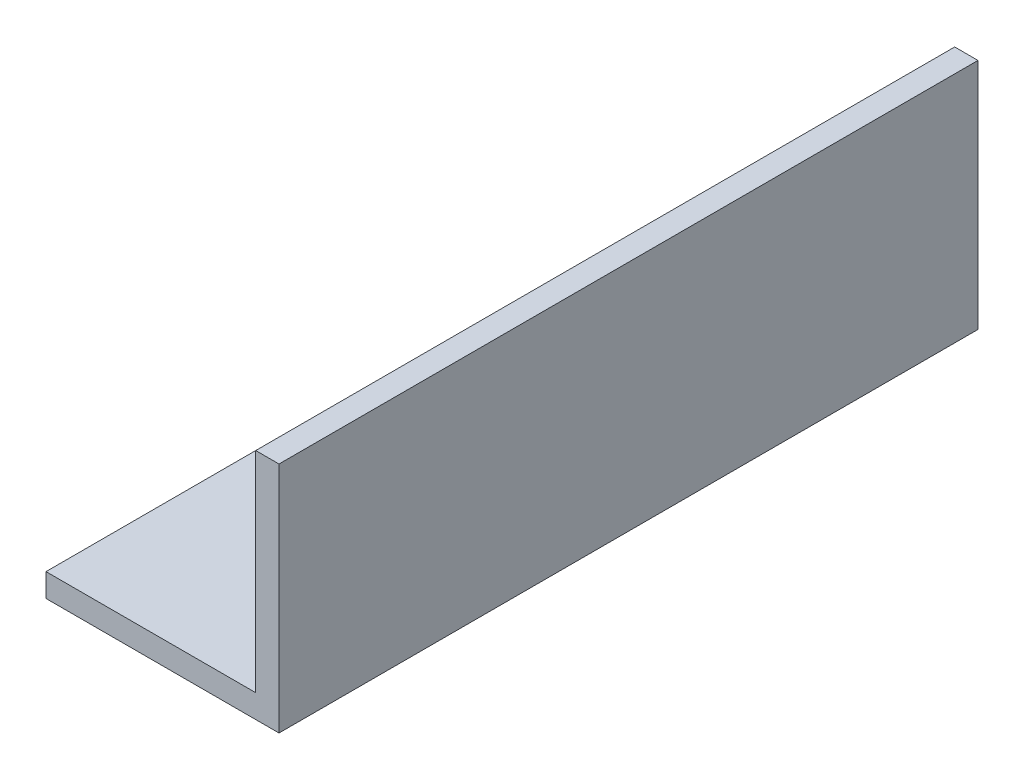
ISO-10303-21;
HEADER;
FILE_DESCRIPTION(('STEP AP214'),'2;1');
FILE_NAME('part.step','',(''),(''),'','','');
FILE_SCHEMA(('AUTOMOTIVE_DESIGN { 1 0 10303 214 1 1 1 1 }'));
ENDSEC;
DATA;
#1=APPLICATION_CONTEXT('core data for automotive mechanical design processes');
#2=APPLICATION_PROTOCOL_DEFINITION('international standard','automotive_design',2000,#1);
#3=PRODUCT_CONTEXT('',#1,'mechanical');
#4=PRODUCT('Part','Part','',(#3));
#5=PRODUCT_RELATED_PRODUCT_CATEGORY('part','',(#4));
#6=PRODUCT_DEFINITION_FORMATION('','',#4);
#7=PRODUCT_DEFINITION_CONTEXT('part definition',#1,'design');
#8=PRODUCT_DEFINITION('design','',#6,#7);
#9=PRODUCT_DEFINITION_SHAPE('','',#8);
#10=(LENGTH_UNIT() NAMED_UNIT(*) SI_UNIT(.MILLI.,.METRE.));
#11=(NAMED_UNIT(*) PLANE_ANGLE_UNIT() SI_UNIT($,.RADIAN.));
#12=(NAMED_UNIT(*) SI_UNIT($,.STERADIAN.) SOLID_ANGLE_UNIT());
#13=UNCERTAINTY_MEASURE_WITH_UNIT(LENGTH_MEASURE(1.E-05),#10,'distance_accuracy_value','');
#14=(GEOMETRIC_REPRESENTATION_CONTEXT(3) GLOBAL_UNCERTAINTY_ASSIGNED_CONTEXT((#13)) GLOBAL_UNIT_ASSIGNED_CONTEXT((#10,
#11,#12)) REPRESENTATION_CONTEXT('',''));
#15=CARTESIAN_POINT('',(0.,0.,0.));
#16=DIRECTION('',(0.,0.,1.));
#17=DIRECTION('',(1.,0.,0.));
#18=AXIS2_PLACEMENT_3D('',#15,#16,#17);
#19=CARTESIAN_POINT('',(-5.,-0.5,30.));
#20=DIRECTION('',(1.,0.,0.));
#21=DIRECTION('',(0.,0.,-1.));
#22=AXIS2_PLACEMENT_3D('',#19,#20,#21);
#23=PLANE('',#22);
#24=DIRECTION('',(0.,-1.,0.));
#25=VECTOR('',#24,1.);
#26=CARTESIAN_POINT('',(-5.,-0.5,0.));
#27=LINE('',#26,#25);
#28=CARTESIAN_POINT('',(-5.,0.5,0.));
#29=VERTEX_POINT('',#28);
#30=CARTESIAN_POINT('',(-5.,-0.5,0.));
#31=VERTEX_POINT('',#30);
#32=EDGE_CURVE('E119',#29,#31,#27,.T.);
#33=ORIENTED_EDGE('',*,*,#32,.T.);
#34=DIRECTION('',(0.,0.,-1.));
#35=VECTOR('',#34,1.);
#36=CARTESIAN_POINT('',(-5.,-0.5,30.));
#37=LINE('',#36,#35);
#38=CARTESIAN_POINT('',(-5.,-0.5,30.));
#39=VERTEX_POINT('',#38);
#40=EDGE_CURVE('E11',#39,#31,#37,.T.);
#41=ORIENTED_EDGE('',*,*,#40,.F.);
#42=DIRECTION('',(0.,-1.,0.));
#43=VECTOR('',#42,1.);
#44=CARTESIAN_POINT('',(-5.,-0.5,30.));
#45=LINE('',#44,#43);
#46=CARTESIAN_POINT('',(-5.,0.5,30.));
#47=VERTEX_POINT('',#46);
#48=EDGE_CURVE('E131',#47,#39,#45,.T.);
#49=ORIENTED_EDGE('',*,*,#48,.F.);
#50=DIRECTION('',(0.,0.,-1.));
#51=VECTOR('',#50,1.);
#52=CARTESIAN_POINT('',(-5.,0.5,30.));
#53=LINE('',#52,#51);
#54=EDGE_CURVE('E115',#47,#29,#53,.T.);
#55=ORIENTED_EDGE('',*,*,#54,.T.);
#56=EDGE_LOOP('',(#33,#41,#49,#55));
#57=FACE_BOUND('',#56,.T.);
#58=ADVANCED_FACE('F35',(#57),#23,.F.);
#59=CARTESIAN_POINT('',(5.,-0.5,30.));
#60=DIRECTION('',(0.,1.,0.));
#61=DIRECTION('',(0.,0.,1.));
#62=AXIS2_PLACEMENT_3D('',#59,#60,#61);
#63=PLANE('',#62);
#64=CARTESIAN_POINT('',(-0.5,-0.5,10.));
#65=DIRECTION('',(0.,1.,0.));
#66=DIRECTION('',(0.,0.,1.));
#67=AXIS2_PLACEMENT_3D('',#64,#65,#66);
#68=CIRCLE('',#67,1.49999999999999);
#69=CARTESIAN_POINT('',(-0.5,-0.5,11.5));
#70=VERTEX_POINT('',#69);
#71=EDGE_CURVE('E227',#70,#70,#68,.T.);
#72=ORIENTED_EDGE('',*,*,#71,.T.);
#73=EDGE_LOOP('',(#72));
#74=FACE_BOUND('',#73,.T.);
#75=CARTESIAN_POINT('',(-0.499999999999999,-0.5,20.));
#76=DIRECTION('',(0.,1.,0.));
#77=DIRECTION('',(0.,0.,1.));
#78=AXIS2_PLACEMENT_3D('',#75,#76,#77);
#79=CIRCLE('',#78,1.49999999999999);
#80=CARTESIAN_POINT('',(-0.499999999999999,-0.5,21.5));
#81=VERTEX_POINT('',#80);
#82=EDGE_CURVE('E123',#81,#81,#79,.T.);
#83=ORIENTED_EDGE('',*,*,#82,.T.);
#84=EDGE_LOOP('',(#83));
#85=FACE_BOUND('',#84,.T.);
#86=DIRECTION('',(1.,0.,0.));
#87=VECTOR('',#86,1.);
#88=CARTESIAN_POINT('',(5.,-0.5,0.));
#89=LINE('',#88,#87);
#90=CARTESIAN_POINT('',(5.,-0.5,0.));
#91=VERTEX_POINT('',#90);
#92=EDGE_CURVE('E122',#31,#91,#89,.T.);
#93=ORIENTED_EDGE('',*,*,#92,.T.);
#94=DIRECTION('',(0.,0.,-1.));
#95=VECTOR('',#94,1.);
#96=CARTESIAN_POINT('',(5.,-0.5,30.));
#97=LINE('',#96,#95);
#98=CARTESIAN_POINT('',(5.,-0.5,30.));
#99=VERTEX_POINT('',#98);
#100=EDGE_CURVE('E43',#99,#91,#97,.T.);
#101=ORIENTED_EDGE('',*,*,#100,.F.);
#102=DIRECTION('',(1.,0.,0.));
#103=VECTOR('',#102,1.);
#104=CARTESIAN_POINT('',(5.,-0.5,30.));
#105=LINE('',#104,#103);
#106=EDGE_CURVE('E88',#39,#99,#105,.T.);
#107=ORIENTED_EDGE('',*,*,#106,.F.);
#108=ORIENTED_EDGE('',*,*,#40,.T.);
#109=EDGE_LOOP('',(#93,#101,#107,#108));
#110=FACE_BOUND('',#109,.T.);
#111=ADVANCED_FACE('F137',(#74,#85,#110),#63,.F.);
#112=CARTESIAN_POINT('',(5.,9.5,30.));
#113=DIRECTION('',(-1.,0.,0.));
#114=DIRECTION('',(0.,-1.,0.));
#115=AXIS2_PLACEMENT_3D('',#112,#113,#114);
#116=PLANE('',#115);
#117=DIRECTION('',(0.,1.,0.));
#118=VECTOR('',#117,1.);
#119=CARTESIAN_POINT('',(5.,9.5,0.));
#120=LINE('',#119,#118);
#121=CARTESIAN_POINT('',(5.,9.5,0.));
#122=VERTEX_POINT('',#121);
#123=EDGE_CURVE('E126',#91,#122,#120,.T.);
#124=ORIENTED_EDGE('',*,*,#123,.T.);
#125=DIRECTION('',(0.,0.,-1.));
#126=VECTOR('',#125,1.);
#127=CARTESIAN_POINT('',(5.,9.5,30.));
#128=LINE('',#127,#126);
#129=CARTESIAN_POINT('',(5.,9.5,30.));
#130=VERTEX_POINT('',#129);
#131=EDGE_CURVE('E110',#130,#122,#128,.T.);
#132=ORIENTED_EDGE('',*,*,#131,.F.);
#133=DIRECTION('',(0.,1.,0.));
#134=VECTOR('',#133,1.);
#135=CARTESIAN_POINT('',(5.,-0.5,30.));
#136=LINE('',#135,#134);
#137=EDGE_CURVE('E101',#99,#130,#136,.T.);
#138=ORIENTED_EDGE('',*,*,#137,.F.);
#139=ORIENTED_EDGE('',*,*,#100,.T.);
#140=EDGE_LOOP('',(#124,#132,#138,#139));
#141=FACE_BOUND('',#140,.T.);
#142=ADVANCED_FACE('F136',(#141),#116,.F.);
#143=CARTESIAN_POINT('',(4.,9.5,30.));
#144=DIRECTION('',(0.,-1.,0.));
#145=DIRECTION('',(0.,0.,-1.));
#146=AXIS2_PLACEMENT_3D('',#143,#144,#145);
#147=PLANE('',#146);
#148=DIRECTION('',(-1.,0.,0.));
#149=VECTOR('',#148,1.);
#150=CARTESIAN_POINT('',(4.,9.5,0.));
#151=LINE('',#150,#149);
#152=CARTESIAN_POINT('',(4.,9.5,0.));
#153=VERTEX_POINT('',#152);
#154=EDGE_CURVE('E109',#122,#153,#151,.T.);
#155=ORIENTED_EDGE('',*,*,#154,.T.);
#156=DIRECTION('',(0.,0.,-1.));
#157=VECTOR('',#156,1.);
#158=CARTESIAN_POINT('',(4.,9.5,30.));
#159=LINE('',#158,#157);
#160=CARTESIAN_POINT('',(4.,9.5,30.));
#161=VERTEX_POINT('',#160);
#162=EDGE_CURVE('E106',#161,#153,#159,.T.);
#163=ORIENTED_EDGE('',*,*,#162,.F.);
#164=DIRECTION('',(-1.,0.,0.));
#165=VECTOR('',#164,1.);
#166=CARTESIAN_POINT('',(4.,9.5,30.));
#167=LINE('',#166,#165);
#168=EDGE_CURVE('E95',#130,#161,#167,.T.);
#169=ORIENTED_EDGE('',*,*,#168,.F.);
#170=ORIENTED_EDGE('',*,*,#131,.T.);
#171=EDGE_LOOP('',(#155,#163,#169,#170));
#172=FACE_BOUND('',#171,.T.);
#173=ADVANCED_FACE('F107',(#172),#147,.F.);
#174=CARTESIAN_POINT('',(4.,9.5,30.));
#175=DIRECTION('',(1.,0.,0.));
#176=DIRECTION('',(0.,0.,-1.));
#177=AXIS2_PLACEMENT_3D('',#174,#175,#176);
#178=PLANE('',#177);
#179=DIRECTION('',(0.,-1.,0.));
#180=VECTOR('',#179,1.);
#181=CARTESIAN_POINT('',(4.,9.5,0.));
#182=LINE('',#181,#180);
#183=CARTESIAN_POINT('',(4.,0.5,0.));
#184=VERTEX_POINT('',#183);
#185=EDGE_CURVE('E74',#153,#184,#182,.T.);
#186=ORIENTED_EDGE('',*,*,#185,.T.);
#187=DIRECTION('',(0.,0.,-1.));
#188=VECTOR('',#187,1.);
#189=CARTESIAN_POINT('',(4.,0.5,30.));
#190=LINE('',#189,#188);
#191=CARTESIAN_POINT('',(4.,0.5,30.));
#192=VERTEX_POINT('',#191);
#193=EDGE_CURVE('E111',#192,#184,#190,.T.);
#194=ORIENTED_EDGE('',*,*,#193,.F.);
#195=DIRECTION('',(0.,-1.,0.));
#196=VECTOR('',#195,1.);
#197=CARTESIAN_POINT('',(4.,9.5,30.));
#198=LINE('',#197,#196);
#199=EDGE_CURVE('E99',#161,#192,#198,.T.);
#200=ORIENTED_EDGE('',*,*,#199,.F.);
#201=ORIENTED_EDGE('',*,*,#162,.T.);
#202=EDGE_LOOP('',(#186,#194,#200,#201));
#203=FACE_BOUND('',#202,.T.);
#204=ADVANCED_FACE('F113',(#203),#178,.F.);
#205=CARTESIAN_POINT('',(4.,0.5,30.));
#206=DIRECTION('',(0.,-1.,0.));
#207=DIRECTION('',(0.,0.,-1.));
#208=AXIS2_PLACEMENT_3D('',#205,#206,#207);
#209=PLANE('',#208);
#210=CARTESIAN_POINT('',(-0.5,0.500000000000001,10.));
#211=DIRECTION('',(0.,1.,0.));
#212=DIRECTION('',(0.,0.,1.));
#213=AXIS2_PLACEMENT_3D('',#210,#211,#212);
#214=CIRCLE('',#213,1.49999999999999);
#215=CARTESIAN_POINT('',(-0.5,0.500000000000001,11.5));
#216=VERTEX_POINT('',#215);
#217=EDGE_CURVE('E229',#216,#216,#214,.T.);
#218=ORIENTED_EDGE('',*,*,#217,.F.);
#219=EDGE_LOOP('',(#218));
#220=FACE_BOUND('',#219,.T.);
#221=CARTESIAN_POINT('',(-0.499999999999999,0.500000000000001,20.));
#222=DIRECTION('',(0.,1.,0.));
#223=DIRECTION('',(0.,0.,1.));
#224=AXIS2_PLACEMENT_3D('',#221,#222,#223);
#225=CIRCLE('',#224,1.49999999999999);
#226=CARTESIAN_POINT('',(-0.499999999999999,0.500000000000001,21.5));
#227=VERTEX_POINT('',#226);
#228=EDGE_CURVE('E231',#227,#227,#225,.T.);
#229=ORIENTED_EDGE('',*,*,#228,.F.);
#230=EDGE_LOOP('',(#229));
#231=FACE_BOUND('',#230,.T.);
#232=DIRECTION('',(-1.,0.,0.));
#233=VECTOR('',#232,1.);
#234=CARTESIAN_POINT('',(4.,0.5,0.));
#235=LINE('',#234,#233);
#236=EDGE_CURVE('E80',#184,#29,#235,.T.);
#237=ORIENTED_EDGE('',*,*,#236,.T.);
#238=ORIENTED_EDGE('',*,*,#54,.F.);
#239=DIRECTION('',(-1.,0.,0.));
#240=VECTOR('',#239,1.);
#241=CARTESIAN_POINT('',(4.,0.5,30.));
#242=LINE('',#241,#240);
#243=EDGE_CURVE('E51',#192,#47,#242,.T.);
#244=ORIENTED_EDGE('',*,*,#243,.F.);
#245=ORIENTED_EDGE('',*,*,#193,.T.);
#246=EDGE_LOOP('',(#237,#238,#244,#245));
#247=FACE_BOUND('',#246,.T.);
#248=ADVANCED_FACE('F144',(#220,#231,#247),#209,.F.);
#249=CARTESIAN_POINT('',(0.,0.,30.));
#250=DIRECTION('',(0.,0.,1.));
#251=DIRECTION('',(1.,0.,0.));
#252=AXIS2_PLACEMENT_3D('',#249,#250,#251);
#253=PLANE('',#252);
#254=ORIENTED_EDGE('',*,*,#48,.T.);
#255=ORIENTED_EDGE('',*,*,#106,.T.);
#256=ORIENTED_EDGE('',*,*,#137,.T.);
#257=ORIENTED_EDGE('',*,*,#168,.T.);
#258=ORIENTED_EDGE('',*,*,#199,.T.);
#259=ORIENTED_EDGE('',*,*,#243,.T.);
#260=EDGE_LOOP('',(#254,#255,#256,#257,#258,#259));
#261=FACE_BOUND('',#260,.T.);
#262=ADVANCED_FACE('F97',(#261),#253,.T.);
#263=CARTESIAN_POINT('',(0.,0.,0.));
#264=DIRECTION('',(0.,0.,1.));
#265=DIRECTION('',(1.,0.,0.));
#266=AXIS2_PLACEMENT_3D('',#263,#264,#265);
#267=PLANE('',#266);
#268=ORIENTED_EDGE('',*,*,#32,.F.);
#269=ORIENTED_EDGE('',*,*,#236,.F.);
#270=ORIENTED_EDGE('',*,*,#185,.F.);
#271=ORIENTED_EDGE('',*,*,#154,.F.);
#272=ORIENTED_EDGE('',*,*,#123,.F.);
#273=ORIENTED_EDGE('',*,*,#92,.F.);
#274=EDGE_LOOP('',(#268,#269,#270,#271,#272,#273));
#275=FACE_BOUND('',#274,.T.);
#276=ADVANCED_FACE('F141',(#275),#267,.F.);
#277=CARTESIAN_POINT('',(-0.499999999999999,0.5,20.));
#278=DIRECTION('',(0.,1.,0.));
#279=DIRECTION('',(0.,0.,1.));
#280=AXIS2_PLACEMENT_3D('',#277,#278,#279);
#281=CYLINDRICAL_SURFACE('',#280,1.49999999999999);
#282=ORIENTED_EDGE('',*,*,#82,.F.);
#283=EDGE_LOOP('',(#282));
#284=FACE_BOUND('',#283,.T.);
#285=ORIENTED_EDGE('',*,*,#228,.T.);
#286=EDGE_LOOP('',(#285));
#287=FACE_BOUND('',#286,.T.);
#288=ADVANCED_FACE('F193',(#284,#287),#281,.F.);
#289=CARTESIAN_POINT('',(-0.5,0.5,10.));
#290=DIRECTION('',(0.,1.,0.));
#291=DIRECTION('',(0.,0.,1.));
#292=AXIS2_PLACEMENT_3D('',#289,#290,#291);
#293=CYLINDRICAL_SURFACE('',#292,1.49999999999999);
#294=ORIENTED_EDGE('',*,*,#71,.F.);
#295=EDGE_LOOP('',(#294));
#296=FACE_BOUND('',#295,.T.);
#297=ORIENTED_EDGE('',*,*,#217,.T.);
#298=EDGE_LOOP('',(#297));
#299=FACE_BOUND('',#298,.T.);
#300=ADVANCED_FACE('F211',(#296,#299),#293,.F.);
#301=CLOSED_SHELL('',(#58,#111,#142,#173,#204,#248,#262,#276,#288,#300));
#302=MANIFOLD_SOLID_BREP('B2',#301);
#303=ADVANCED_BREP_SHAPE_REPRESENTATION('',(#18,#302),#14);
#304=SHAPE_DEFINITION_REPRESENTATION(#9,#303);
ENDSEC;
END-ISO-10303-21;
